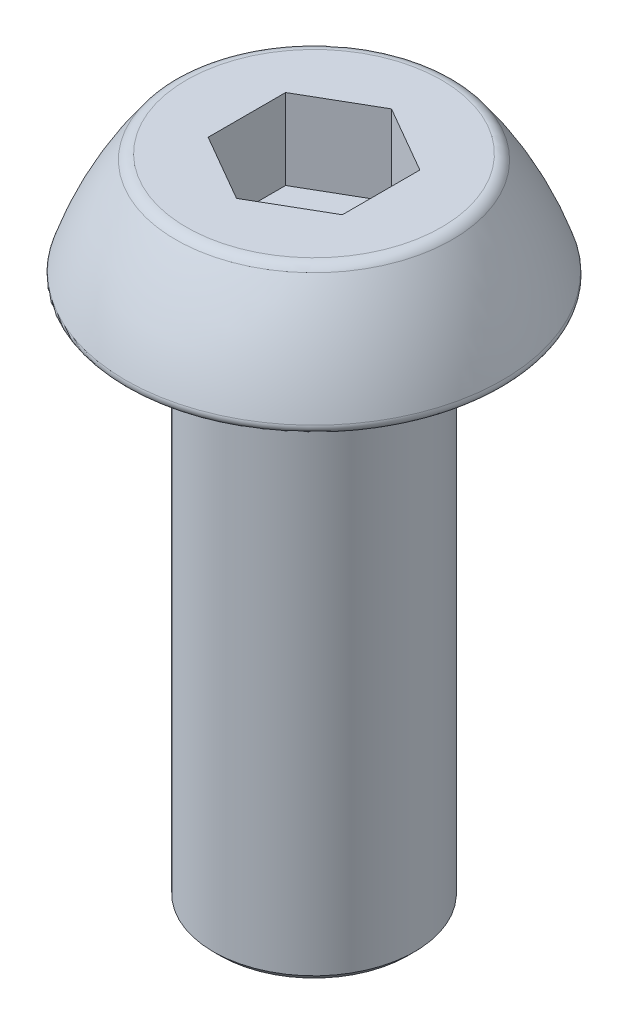
ISO-10303-21;
HEADER;
FILE_DESCRIPTION(('STEP AP214'),'2;1');
FILE_NAME('part.step','',(''),(''),'','','');
FILE_SCHEMA(('AUTOMOTIVE_DESIGN { 1 0 10303 214 1 1 1 1 }'));
ENDSEC;
DATA;
#1=APPLICATION_CONTEXT('core data for automotive mechanical design processes');
#2=APPLICATION_PROTOCOL_DEFINITION('international standard','automotive_design',2000,#1);
#3=PRODUCT_CONTEXT('',#1,'mechanical');
#4=PRODUCT('Part','Part','',(#3));
#5=PRODUCT_RELATED_PRODUCT_CATEGORY('part','',(#4));
#6=PRODUCT_DEFINITION_FORMATION('','',#4);
#7=PRODUCT_DEFINITION_CONTEXT('part definition',#1,'design');
#8=PRODUCT_DEFINITION('design','',#6,#7);
#9=PRODUCT_DEFINITION_SHAPE('','',#8);
#10=(LENGTH_UNIT() NAMED_UNIT(*) SI_UNIT(.MILLI.,.METRE.));
#11=(NAMED_UNIT(*) PLANE_ANGLE_UNIT() SI_UNIT($,.RADIAN.));
#12=(NAMED_UNIT(*) SI_UNIT($,.STERADIAN.) SOLID_ANGLE_UNIT());
#13=UNCERTAINTY_MEASURE_WITH_UNIT(LENGTH_MEASURE(1.E-05),#10,'distance_accuracy_value','');
#14=(GEOMETRIC_REPRESENTATION_CONTEXT(3) GLOBAL_UNCERTAINTY_ASSIGNED_CONTEXT((#13)) GLOBAL_UNIT_ASSIGNED_CONTEXT((#10,
#11,#12)) REPRESENTATION_CONTEXT('',''));
#15=CARTESIAN_POINT('',(0.,0.,0.));
#16=DIRECTION('',(0.,0.,1.));
#17=DIRECTION('',(1.,0.,0.));
#18=AXIS2_PLACEMENT_3D('',#15,#16,#17);
#19=CARTESIAN_POINT('',(0.,0.,0.));
#20=DIRECTION('',(0.,1.,0.));
#21=DIRECTION('',(0.,0.,1.));
#22=AXIS2_PLACEMENT_3D('',#19,#20,#21);
#23=PLANE('',#22);
#24=CARTESIAN_POINT('',(0.,0.,0.));
#25=DIRECTION('',(0.,1.,0.));
#26=DIRECTION('',(0.,0.,1.));
#27=AXIS2_PLACEMENT_3D('',#24,#25,#26);
#28=CIRCLE('',#27,2.71401101775283);
#29=CARTESIAN_POINT('',(0.,0.,2.71401101775283));
#30=VERTEX_POINT('',#29);
#31=EDGE_CURVE('E118',#30,#30,#28,.F.);
#32=ORIENTED_EDGE('',*,*,#31,.T.);
#33=EDGE_LOOP('',(#32));
#34=FACE_BOUND('',#33,.T.);
#35=CARTESIAN_POINT('',(0.,0.,0.));
#36=DIRECTION('',(0.,1.,0.));
#37=DIRECTION('',(0.,0.,1.));
#38=AXIS2_PLACEMENT_3D('',#35,#36,#37);
#39=CIRCLE('',#38,1.5);
#40=CARTESIAN_POINT('',(0.,0.,1.5));
#41=VERTEX_POINT('',#40);
#42=EDGE_CURVE('E137',#41,#41,#39,.F.);
#43=ORIENTED_EDGE('',*,*,#42,.F.);
#44=EDGE_LOOP('',(#43));
#45=FACE_BOUND('',#44,.T.);
#46=ADVANCED_FACE('F17',(#34,#45),#23,.F.);
#47=CARTESIAN_POINT('',(-2.,1.65,0.));
#48=DIRECTION('',(0.,-1.,0.));
#49=DIRECTION('',(0.,0.,-1.));
#50=AXIS2_PLACEMENT_3D('',#47,#48,#49);
#51=PLANE('',#50);
#52=DIRECTION('',(-0.866025403784439,0.,0.5));
#53=VECTOR('',#52,1.);
#54=CARTESIAN_POINT('',(0.,1.65,-1.15470053837925));
#55=LINE('',#54,#53);
#56=CARTESIAN_POINT('',(0.,1.65,-1.15470053837925));
#57=VERTEX_POINT('',#56);
#58=CARTESIAN_POINT('',(-1.,1.65,-0.577350269189626));
#59=VERTEX_POINT('',#58);
#60=EDGE_CURVE('E106',#57,#59,#55,.T.);
#61=ORIENTED_EDGE('',*,*,#60,.F.);
#62=DIRECTION('',(-0.866025403784439,0.,-0.5));
#63=VECTOR('',#62,1.);
#64=CARTESIAN_POINT('',(1.,1.65,-0.577350269189626));
#65=LINE('',#64,#63);
#66=CARTESIAN_POINT('',(1.,1.65,-0.577350269189626));
#67=VERTEX_POINT('',#66);
#68=EDGE_CURVE('E32',#67,#57,#65,.T.);
#69=ORIENTED_EDGE('',*,*,#68,.F.);
#70=DIRECTION('',(0.,0.,-1.));
#71=VECTOR('',#70,1.);
#72=CARTESIAN_POINT('',(1.,1.65,0.577350269189626));
#73=LINE('',#72,#71);
#74=CARTESIAN_POINT('',(1.,1.65,0.577350269189626));
#75=VERTEX_POINT('',#74);
#76=EDGE_CURVE('E113',#75,#67,#73,.T.);
#77=ORIENTED_EDGE('',*,*,#76,.F.);
#78=DIRECTION('',(0.866025403784439,0.,-0.5));
#79=VECTOR('',#78,1.);
#80=CARTESIAN_POINT('',(0.,1.65,1.15470053837925));
#81=LINE('',#80,#79);
#82=CARTESIAN_POINT('',(0.,1.65,1.15470053837925));
#83=VERTEX_POINT('',#82);
#84=EDGE_CURVE('E114',#83,#75,#81,.T.);
#85=ORIENTED_EDGE('',*,*,#84,.F.);
#86=DIRECTION('',(0.866025403784439,0.,0.5));
#87=VECTOR('',#86,1.);
#88=CARTESIAN_POINT('',(-1.,1.65,0.577350269189626));
#89=LINE('',#88,#87);
#90=CARTESIAN_POINT('',(-1.,1.65,0.577350269189626));
#91=VERTEX_POINT('',#90);
#92=EDGE_CURVE('E79',#91,#83,#89,.T.);
#93=ORIENTED_EDGE('',*,*,#92,.F.);
#94=DIRECTION('',(0.,0.,1.));
#95=VECTOR('',#94,1.);
#96=CARTESIAN_POINT('',(-1.,1.65,-0.577350269189626));
#97=LINE('',#96,#95);
#98=EDGE_CURVE('E108',#59,#91,#97,.T.);
#99=ORIENTED_EDGE('',*,*,#98,.F.);
#100=EDGE_LOOP('',(#61,#69,#77,#85,#93,#99));
#101=FACE_BOUND('',#100,.T.);
#102=CARTESIAN_POINT('',(0.,1.65,0.));
#103=DIRECTION('',(0.,-1.,0.));
#104=DIRECTION('',(0.,0.,-1.));
#105=AXIS2_PLACEMENT_3D('',#102,#103,#104);
#106=CIRCLE('',#105,1.90110924353599);
#107=CARTESIAN_POINT('',(0.,1.65,-1.90110924353599));
#108=VERTEX_POINT('',#107);
#109=EDGE_CURVE('E132',#108,#108,#106,.F.);
#110=ORIENTED_EDGE('',*,*,#109,.T.);
#111=EDGE_LOOP('',(#110));
#112=FACE_BOUND('',#111,.T.);
#113=ADVANCED_FACE('F152',(#101,#112),#51,.F.);
#114=CARTESIAN_POINT('',(0.,-1.42499576680782,0.));
#115=DIRECTION('',(0.,-1.,0.));
#116=DIRECTION('',(0.,0.,-1.));
#117=AXIS2_PLACEMENT_3D('',#114,#115,#116);
#118=DEGENERATE_TOROIDAL_SURFACE('',#117,1.94263884145048,5.,.F.);
#119=CARTESIAN_POINT('',(0.,1.56979149028366,0.));
#120=DIRECTION('',(0.,-1.,0.));
#121=DIRECTION('',(0.,0.,-1.));
#122=AXIS2_PLACEMENT_3D('',#119,#120,#121);
#123=CIRCLE('',#122,2.06126541374375);
#124=CARTESIAN_POINT('',(0.,1.56979149028366,-2.06126541374375));
#125=VERTEX_POINT('',#124);
#126=EDGE_CURVE('E129',#125,#125,#123,.T.);
#127=ORIENTED_EDGE('',*,*,#126,.T.);
#128=EDGE_LOOP('',(#127));
#129=FACE_BOUND('',#128,.T.);
#130=CARTESIAN_POINT('',(0.,0.131122362587915,0.));
#131=DIRECTION('',(0.,-1.,0.));
#132=DIRECTION('',(0.,0.,-1.));
#133=AXIS2_PLACEMENT_3D('',#130,#131,#132);
#134=CIRCLE('',#133,2.80904468834882);
#135=CARTESIAN_POINT('',(0.,0.131122362587915,-2.80904468834882));
#136=VERTEX_POINT('',#135);
#137=EDGE_CURVE('E126',#136,#136,#134,.F.);
#138=ORIENTED_EDGE('',*,*,#137,.T.);
#139=EDGE_LOOP('',(#138));
#140=FACE_BOUND('',#139,.T.);
#141=ADVANCED_FACE('F161',(#129,#140),#118,.F.);
#142=CARTESIAN_POINT('',(0.,0.1,0.));
#143=DIRECTION('',(0.,1.,0.));
#144=DIRECTION('',(0.,0.,1.));
#145=AXIS2_PLACEMENT_3D('',#142,#143,#144);
#146=TOROIDAL_SURFACE('',#145,2.71401101775283,0.1);
#147=ORIENTED_EDGE('',*,*,#137,.F.);
#148=EDGE_LOOP('',(#147));
#149=FACE_BOUND('',#148,.T.);
#150=ORIENTED_EDGE('',*,*,#31,.F.);
#151=EDGE_LOOP('',(#150));
#152=FACE_BOUND('',#151,.T.);
#153=ADVANCED_FACE('F168',(#149,#152),#146,.T.);
#154=CARTESIAN_POINT('',(0.,1.45,0.));
#155=DIRECTION('',(0.,-1.,0.));
#156=DIRECTION('',(0.,0.,-1.));
#157=AXIS2_PLACEMENT_3D('',#154,#155,#156);
#158=TOROIDAL_SURFACE('',#157,1.90110924353599,0.2);
#159=ORIENTED_EDGE('',*,*,#109,.F.);
#160=EDGE_LOOP('',(#159));
#161=FACE_BOUND('',#160,.T.);
#162=ORIENTED_EDGE('',*,*,#126,.F.);
#163=EDGE_LOOP('',(#162));
#164=FACE_BOUND('',#163,.T.);
#165=ADVANCED_FACE('F173',(#161,#164),#158,.T.);
#166=CARTESIAN_POINT('',(1.,0.45,-0.577350269189626));
#167=DIRECTION('',(0.5,0.,-0.866025403784439));
#168=DIRECTION('',(-0.866025403784439,0.,-0.5));
#169=AXIS2_PLACEMENT_3D('',#166,#167,#168);
#170=PLANE('',#169);
#171=ORIENTED_EDGE('',*,*,#68,.T.);
#172=DIRECTION('',(0.,1.,0.));
#173=VECTOR('',#172,1.);
#174=CARTESIAN_POINT('',(0.,0.45,-1.15470053837925));
#175=LINE('',#174,#173);
#176=CARTESIAN_POINT('',(0.,0.45,-1.15470053837925));
#177=VERTEX_POINT('',#176);
#178=EDGE_CURVE('E62',#177,#57,#175,.T.);
#179=ORIENTED_EDGE('',*,*,#178,.F.);
#180=DIRECTION('',(-0.866025403784439,0.,-0.5));
#181=VECTOR('',#180,1.);
#182=CARTESIAN_POINT('',(1.,0.45,-0.577350269189626));
#183=LINE('',#182,#181);
#184=CARTESIAN_POINT('',(1.,0.45,-0.577350269189626));
#185=VERTEX_POINT('',#184);
#186=EDGE_CURVE('E117',#185,#177,#183,.T.);
#187=ORIENTED_EDGE('',*,*,#186,.F.);
#188=DIRECTION('',(0.,1.,0.));
#189=VECTOR('',#188,1.);
#190=CARTESIAN_POINT('',(1.,0.45,-0.577350269189626));
#191=LINE('',#190,#189);
#192=EDGE_CURVE('E37',#185,#67,#191,.T.);
#193=ORIENTED_EDGE('',*,*,#192,.T.);
#194=EDGE_LOOP('',(#171,#179,#187,#193));
#195=FACE_BOUND('',#194,.T.);
#196=ADVANCED_FACE('F170',(#195),#170,.F.);
#197=CARTESIAN_POINT('',(1.,0.45,0.577350269189626));
#198=DIRECTION('',(1.,0.,0.));
#199=DIRECTION('',(0.,0.,-1.));
#200=AXIS2_PLACEMENT_3D('',#197,#198,#199);
#201=PLANE('',#200);
#202=ORIENTED_EDGE('',*,*,#76,.T.);
#203=ORIENTED_EDGE('',*,*,#192,.F.);
#204=DIRECTION('',(0.,0.,-1.));
#205=VECTOR('',#204,1.);
#206=CARTESIAN_POINT('',(1.,0.45,0.577350269189626));
#207=LINE('',#206,#205);
#208=CARTESIAN_POINT('',(1.,0.45,0.577350269189626));
#209=VERTEX_POINT('',#208);
#210=EDGE_CURVE('E95',#209,#185,#207,.T.);
#211=ORIENTED_EDGE('',*,*,#210,.F.);
#212=DIRECTION('',(0.,1.,0.));
#213=VECTOR('',#212,1.);
#214=CARTESIAN_POINT('',(1.,0.45,0.577350269189626));
#215=LINE('',#214,#213);
#216=EDGE_CURVE('E81',#209,#75,#215,.T.);
#217=ORIENTED_EDGE('',*,*,#216,.T.);
#218=EDGE_LOOP('',(#202,#203,#211,#217));
#219=FACE_BOUND('',#218,.T.);
#220=ADVANCED_FACE('F181',(#219),#201,.F.);
#221=CARTESIAN_POINT('',(0.,0.45,1.15470053837925));
#222=DIRECTION('',(0.5,0.,0.866025403784439));
#223=DIRECTION('',(0.866025403784439,0.,-0.5));
#224=AXIS2_PLACEMENT_3D('',#221,#222,#223);
#225=PLANE('',#224);
#226=ORIENTED_EDGE('',*,*,#84,.T.);
#227=ORIENTED_EDGE('',*,*,#216,.F.);
#228=DIRECTION('',(0.866025403784439,0.,-0.5));
#229=VECTOR('',#228,1.);
#230=CARTESIAN_POINT('',(0.,0.45,1.15470053837925));
#231=LINE('',#230,#229);
#232=CARTESIAN_POINT('',(0.,0.45,1.15470053837925));
#233=VERTEX_POINT('',#232);
#234=EDGE_CURVE('E86',#233,#209,#231,.T.);
#235=ORIENTED_EDGE('',*,*,#234,.F.);
#236=DIRECTION('',(0.,1.,0.));
#237=VECTOR('',#236,1.);
#238=CARTESIAN_POINT('',(0.,0.45,1.15470053837925));
#239=LINE('',#238,#237);
#240=EDGE_CURVE('E73',#233,#83,#239,.T.);
#241=ORIENTED_EDGE('',*,*,#240,.T.);
#242=EDGE_LOOP('',(#226,#227,#235,#241));
#243=FACE_BOUND('',#242,.T.);
#244=ADVANCED_FACE('F90',(#243),#225,.F.);
#245=CARTESIAN_POINT('',(-1.,0.45,0.577350269189626));
#246=DIRECTION('',(-0.5,0.,0.866025403784439));
#247=DIRECTION('',(0.866025403784439,0.,0.5));
#248=AXIS2_PLACEMENT_3D('',#245,#246,#247);
#249=PLANE('',#248);
#250=ORIENTED_EDGE('',*,*,#92,.T.);
#251=ORIENTED_EDGE('',*,*,#240,.F.);
#252=DIRECTION('',(0.866025403784439,0.,0.5));
#253=VECTOR('',#252,1.);
#254=CARTESIAN_POINT('',(-1.,0.45,0.577350269189626));
#255=LINE('',#254,#253);
#256=CARTESIAN_POINT('',(-1.,0.45,0.577350269189626));
#257=VERTEX_POINT('',#256);
#258=EDGE_CURVE('E80',#257,#233,#255,.T.);
#259=ORIENTED_EDGE('',*,*,#258,.F.);
#260=DIRECTION('',(0.,1.,0.));
#261=VECTOR('',#260,1.);
#262=CARTESIAN_POINT('',(-1.,0.45,0.577350269189626));
#263=LINE('',#262,#261);
#264=EDGE_CURVE('E83',#257,#91,#263,.T.);
#265=ORIENTED_EDGE('',*,*,#264,.T.);
#266=EDGE_LOOP('',(#250,#251,#259,#265));
#267=FACE_BOUND('',#266,.T.);
#268=ADVANCED_FACE('F74',(#267),#249,.F.);
#269=CARTESIAN_POINT('',(-1.,0.45,-0.577350269189626));
#270=DIRECTION('',(-1.,0.,0.));
#271=DIRECTION('',(0.,0.,1.));
#272=AXIS2_PLACEMENT_3D('',#269,#270,#271);
#273=PLANE('',#272);
#274=ORIENTED_EDGE('',*,*,#98,.T.);
#275=ORIENTED_EDGE('',*,*,#264,.F.);
#276=DIRECTION('',(0.,0.,1.));
#277=VECTOR('',#276,1.);
#278=CARTESIAN_POINT('',(-1.,0.45,-0.577350269189626));
#279=LINE('',#278,#277);
#280=CARTESIAN_POINT('',(-1.,0.45,-0.577350269189626));
#281=VERTEX_POINT('',#280);
#282=EDGE_CURVE('E98',#281,#257,#279,.T.);
#283=ORIENTED_EDGE('',*,*,#282,.F.);
#284=DIRECTION('',(0.,1.,0.));
#285=VECTOR('',#284,1.);
#286=CARTESIAN_POINT('',(-1.,0.45,-0.577350269189626));
#287=LINE('',#286,#285);
#288=EDGE_CURVE('E121',#281,#59,#287,.T.);
#289=ORIENTED_EDGE('',*,*,#288,.T.);
#290=EDGE_LOOP('',(#274,#275,#283,#289));
#291=FACE_BOUND('',#290,.T.);
#292=ADVANCED_FACE('F206',(#291),#273,.F.);
#293=CARTESIAN_POINT('',(0.,0.45,-1.15470053837925));
#294=DIRECTION('',(-0.5,0.,-0.866025403784439));
#295=DIRECTION('',(-0.866025403784439,0.,0.5));
#296=AXIS2_PLACEMENT_3D('',#293,#294,#295);
#297=PLANE('',#296);
#298=ORIENTED_EDGE('',*,*,#60,.T.);
#299=ORIENTED_EDGE('',*,*,#288,.F.);
#300=DIRECTION('',(-0.866025403784439,0.,0.5));
#301=VECTOR('',#300,1.);
#302=CARTESIAN_POINT('',(0.,0.45,-1.15470053837925));
#303=LINE('',#302,#301);
#304=EDGE_CURVE('E99',#177,#281,#303,.T.);
#305=ORIENTED_EDGE('',*,*,#304,.F.);
#306=ORIENTED_EDGE('',*,*,#178,.T.);
#307=EDGE_LOOP('',(#298,#299,#305,#306));
#308=FACE_BOUND('',#307,.T.);
#309=ADVANCED_FACE('F208',(#308),#297,.F.);
#310=CARTESIAN_POINT('',(0.,0.45,0.));
#311=DIRECTION('',(0.,1.,0.));
#312=DIRECTION('',(0.,0.,1.));
#313=AXIS2_PLACEMENT_3D('',#310,#311,#312);
#314=PLANE('',#313);
#315=ORIENTED_EDGE('',*,*,#186,.T.);
#316=ORIENTED_EDGE('',*,*,#304,.T.);
#317=ORIENTED_EDGE('',*,*,#282,.T.);
#318=ORIENTED_EDGE('',*,*,#258,.T.);
#319=ORIENTED_EDGE('',*,*,#234,.T.);
#320=ORIENTED_EDGE('',*,*,#210,.T.);
#321=EDGE_LOOP('',(#315,#316,#317,#318,#319,#320));
#322=FACE_BOUND('',#321,.T.);
#323=ADVANCED_FACE('F92',(#322),#314,.T.);
#324=CARTESIAN_POINT('',(0.,-8.,0.));
#325=DIRECTION('',(0.,1.,0.));
#326=DIRECTION('',(0.,0.,1.));
#327=AXIS2_PLACEMENT_3D('',#324,#325,#326);
#328=CYLINDRICAL_SURFACE('',#327,1.5);
#329=CARTESIAN_POINT('',(0.,-7.9,0.));
#330=DIRECTION('',(0.,-1.,0.));
#331=DIRECTION('',(0.,0.,-1.));
#332=AXIS2_PLACEMENT_3D('',#329,#330,#331);
#333=CIRCLE('',#332,1.5);
#334=CARTESIAN_POINT('',(0.,-7.9,-1.5));
#335=VERTEX_POINT('',#334);
#336=EDGE_CURVE('E11',#335,#335,#333,.F.);
#337=ORIENTED_EDGE('',*,*,#336,.T.);
#338=EDGE_LOOP('',(#337));
#339=FACE_BOUND('',#338,.T.);
#340=ORIENTED_EDGE('',*,*,#42,.T.);
#341=EDGE_LOOP('',(#340));
#342=FACE_BOUND('',#341,.T.);
#343=ADVANCED_FACE('F147',(#339,#342),#328,.T.);
#344=CARTESIAN_POINT('',(0.,-8.,0.));
#345=DIRECTION('',(0.,-1.,0.));
#346=DIRECTION('',(0.,0.,-1.));
#347=AXIS2_PLACEMENT_3D('',#344,#345,#346);
#348=PLANE('',#347);
#349=CARTESIAN_POINT('',(0.,-8.,0.));
#350=DIRECTION('',(0.,-1.,0.));
#351=DIRECTION('',(0.,0.,-1.));
#352=AXIS2_PLACEMENT_3D('',#349,#350,#351);
#353=CIRCLE('',#352,1.4);
#354=CARTESIAN_POINT('',(0.,-8.,-1.4));
#355=VERTEX_POINT('',#354);
#356=EDGE_CURVE('E25',#355,#355,#353,.T.);
#357=ORIENTED_EDGE('',*,*,#356,.T.);
#358=EDGE_LOOP('',(#357));
#359=FACE_BOUND('',#358,.T.);
#360=ADVANCED_FACE('F143',(#359),#348,.T.);
#361=CARTESIAN_POINT('',(0.,-8.,0.));
#362=DIRECTION('',(0.,1.,0.));
#363=DIRECTION('',(0.,0.,1.));
#364=AXIS2_PLACEMENT_3D('',#361,#362,#363);
#365=CONICAL_SURFACE('',#364,1.4,0.785398163397444);
#366=ORIENTED_EDGE('',*,*,#336,.F.);
#367=EDGE_LOOP('',(#366));
#368=FACE_BOUND('',#367,.T.);
#369=ORIENTED_EDGE('',*,*,#356,.F.);
#370=EDGE_LOOP('',(#369));
#371=FACE_BOUND('',#370,.T.);
#372=ADVANCED_FACE('F19',(#368,#371),#365,.T.);
#373=CLOSED_SHELL('',(#46,#113,#141,#153,#165,#196,#220,#244,#268,#292,#309,#323,#343,#360,#372));
#374=MANIFOLD_SOLID_BREP('B1',#373);
#375=ADVANCED_BREP_SHAPE_REPRESENTATION('',(#18,#374),#14);
#376=SHAPE_DEFINITION_REPRESENTATION(#9,#375);
ENDSEC;
END-ISO-10303-21;
